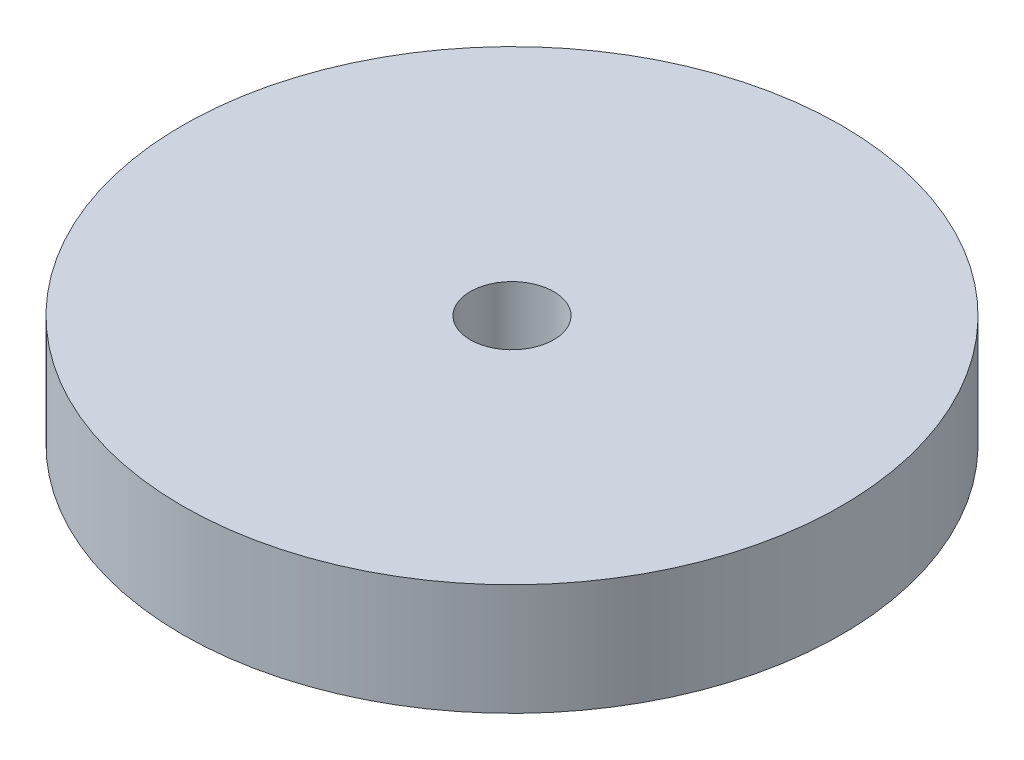
ISO-10303-21;
HEADER;
FILE_DESCRIPTION(('STEP AP214'),'2;1');
FILE_NAME('part.step','',(''),(''),'','','');
FILE_SCHEMA(('AUTOMOTIVE_DESIGN { 1 0 10303 214 1 1 1 1 }'));
ENDSEC;
DATA;
#1=APPLICATION_CONTEXT('core data for automotive mechanical design processes');
#2=APPLICATION_PROTOCOL_DEFINITION('international standard','automotive_design',2000,#1);
#3=PRODUCT_CONTEXT('',#1,'mechanical');
#4=PRODUCT('Part','Part','',(#3));
#5=PRODUCT_RELATED_PRODUCT_CATEGORY('part','',(#4));
#6=PRODUCT_DEFINITION_FORMATION('','',#4);
#7=PRODUCT_DEFINITION_CONTEXT('part definition',#1,'design');
#8=PRODUCT_DEFINITION('design','',#6,#7);
#9=PRODUCT_DEFINITION_SHAPE('','',#8);
#10=(LENGTH_UNIT() NAMED_UNIT(*) SI_UNIT(.MILLI.,.METRE.));
#11=(NAMED_UNIT(*) PLANE_ANGLE_UNIT() SI_UNIT($,.RADIAN.));
#12=(NAMED_UNIT(*) SI_UNIT($,.STERADIAN.) SOLID_ANGLE_UNIT());
#13=UNCERTAINTY_MEASURE_WITH_UNIT(LENGTH_MEASURE(1.E-05),#10,'distance_accuracy_value','');
#14=(GEOMETRIC_REPRESENTATION_CONTEXT(3) GLOBAL_UNCERTAINTY_ASSIGNED_CONTEXT((#13)) GLOBAL_UNIT_ASSIGNED_CONTEXT((#10,
#11,#12)) REPRESENTATION_CONTEXT('',''));
#15=CARTESIAN_POINT('',(0.,0.,0.));
#16=DIRECTION('',(0.,0.,1.));
#17=DIRECTION('',(1.,0.,0.));
#18=AXIS2_PLACEMENT_3D('',#15,#16,#17);
#19=CARTESIAN_POINT('',(0.,12.,0.));
#20=DIRECTION('',(0.,-1.,0.));
#21=DIRECTION('',(0.,0.,-1.));
#22=AXIS2_PLACEMENT_3D('',#19,#20,#21);
#23=CYLINDRICAL_SURFACE('',#22,35.5);
#24=CARTESIAN_POINT('',(0.,12.,0.));
#25=DIRECTION('',(0.,1.,0.));
#26=DIRECTION('',(0.,0.,1.));
#27=AXIS2_PLACEMENT_3D('',#24,#25,#26);
#28=CIRCLE('',#27,35.5);
#29=CARTESIAN_POINT('',(0.,12.,35.5));
#30=VERTEX_POINT('',#29);
#31=EDGE_CURVE('E10',#30,#30,#28,.T.);
#32=ORIENTED_EDGE('',*,*,#31,.F.);
#33=EDGE_LOOP('',(#32));
#34=FACE_BOUND('',#33,.T.);
#35=CARTESIAN_POINT('',(0.,0.,0.));
#36=DIRECTION('',(0.,1.,0.));
#37=DIRECTION('',(0.,0.,1.));
#38=AXIS2_PLACEMENT_3D('',#35,#36,#37);
#39=CIRCLE('',#38,35.5);
#40=CARTESIAN_POINT('',(0.,0.,35.5));
#41=VERTEX_POINT('',#40);
#42=EDGE_CURVE('E42',#41,#41,#39,.T.);
#43=ORIENTED_EDGE('',*,*,#42,.T.);
#44=EDGE_LOOP('',(#43));
#45=FACE_BOUND('',#44,.T.);
#46=ADVANCED_FACE('F39',(#34,#45),#23,.T.);
#47=CARTESIAN_POINT('',(0.,12.,0.));
#48=DIRECTION('',(0.,1.,0.));
#49=DIRECTION('',(0.,0.,1.));
#50=AXIS2_PLACEMENT_3D('',#47,#48,#49);
#51=PLANE('',#50);
#52=CARTESIAN_POINT('',(0.,12.,0.));
#53=DIRECTION('',(0.,1.,0.));
#54=DIRECTION('',(0.,0.,1.));
#55=AXIS2_PLACEMENT_3D('',#52,#53,#54);
#56=CIRCLE('',#55,4.5);
#57=CARTESIAN_POINT('',(0.,12.,4.5));
#58=VERTEX_POINT('',#57);
#59=EDGE_CURVE('E51',#58,#58,#56,.T.);
#60=ORIENTED_EDGE('',*,*,#59,.F.);
#61=EDGE_LOOP('',(#60));
#62=FACE_BOUND('',#61,.T.);
#63=ORIENTED_EDGE('',*,*,#31,.T.);
#64=EDGE_LOOP('',(#63));
#65=FACE_BOUND('',#64,.T.);
#66=ADVANCED_FACE('F66',(#62,#65),#51,.T.);
#67=CARTESIAN_POINT('',(0.,0.,0.));
#68=DIRECTION('',(0.,1.,0.));
#69=DIRECTION('',(0.,0.,1.));
#70=AXIS2_PLACEMENT_3D('',#67,#68,#69);
#71=PLANE('',#70);
#72=CARTESIAN_POINT('',(0.,0.,0.));
#73=DIRECTION('',(0.,1.,0.));
#74=DIRECTION('',(0.,0.,1.));
#75=AXIS2_PLACEMENT_3D('',#72,#73,#74);
#76=CIRCLE('',#75,4.5);
#77=CARTESIAN_POINT('',(0.,0.,4.5));
#78=VERTEX_POINT('',#77);
#79=EDGE_CURVE('E49',#78,#78,#76,.T.);
#80=ORIENTED_EDGE('',*,*,#79,.T.);
#81=EDGE_LOOP('',(#80));
#82=FACE_BOUND('',#81,.T.);
#83=ORIENTED_EDGE('',*,*,#42,.F.);
#84=EDGE_LOOP('',(#83));
#85=FACE_BOUND('',#84,.T.);
#86=ADVANCED_FACE('F57',(#82,#85),#71,.F.);
#87=CARTESIAN_POINT('',(0.,0.,0.));
#88=DIRECTION('',(0.,1.,0.));
#89=DIRECTION('',(0.,0.,1.));
#90=AXIS2_PLACEMENT_3D('',#87,#88,#89);
#91=CYLINDRICAL_SURFACE('',#90,4.5);
#92=ORIENTED_EDGE('',*,*,#79,.F.);
#93=EDGE_LOOP('',(#92));
#94=FACE_BOUND('',#93,.T.);
#95=ORIENTED_EDGE('',*,*,#59,.T.);
#96=EDGE_LOOP('',(#95));
#97=FACE_BOUND('',#96,.T.);
#98=ADVANCED_FACE('F60',(#94,#97),#91,.F.);
#99=CLOSED_SHELL('',(#46,#66,#86,#98));
#100=MANIFOLD_SOLID_BREP('B2',#99);
#101=ADVANCED_BREP_SHAPE_REPRESENTATION('',(#18,#100),#14);
#102=SHAPE_DEFINITION_REPRESENTATION(#9,#101);
ENDSEC;
END-ISO-10303-21;
